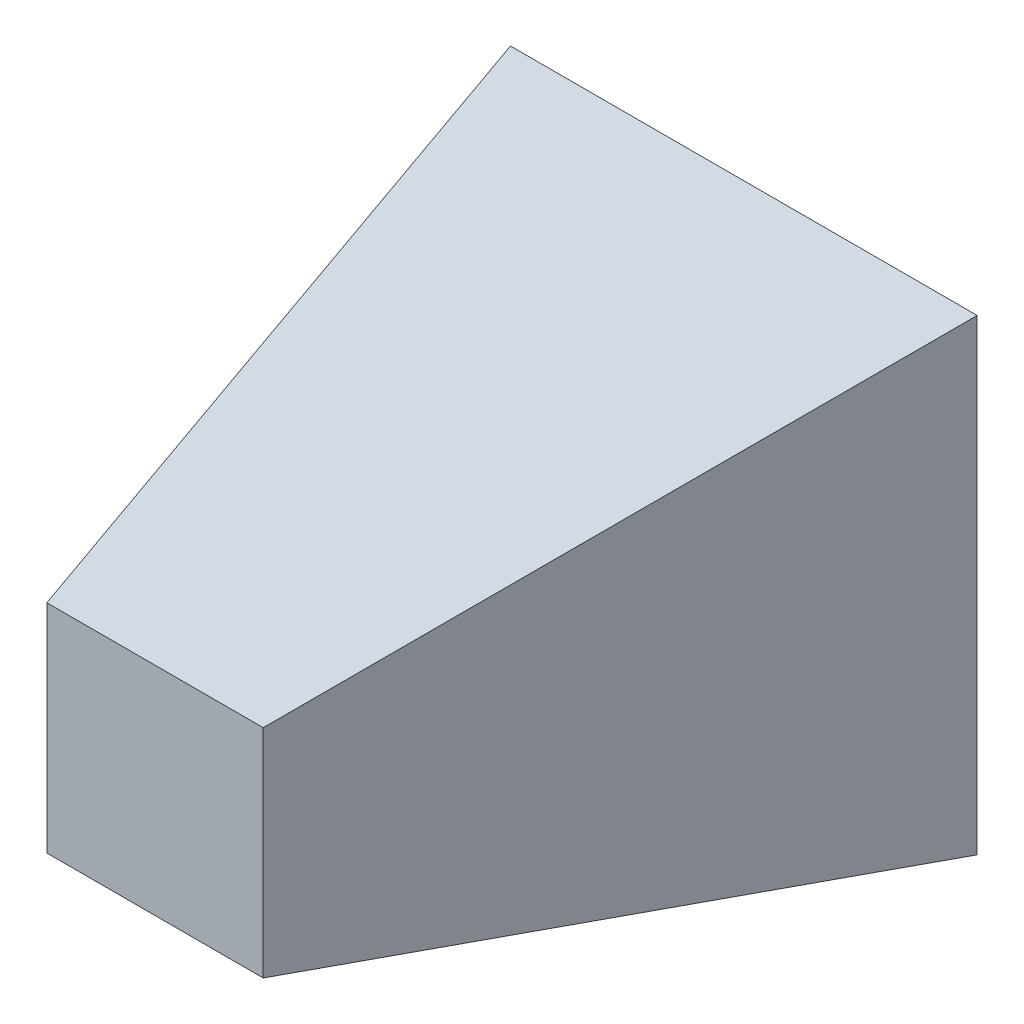
ISO-10303-21;
HEADER;
FILE_DESCRIPTION(('STEP AP214'),'2;1');
FILE_NAME('part.step','',(''),(''),'','','');
FILE_SCHEMA(('AUTOMOTIVE_DESIGN { 1 0 10303 214 1 1 1 1 }'));
ENDSEC;
DATA;
#1=APPLICATION_CONTEXT('core data for automotive mechanical design processes');
#2=APPLICATION_PROTOCOL_DEFINITION('international standard','automotive_design',2000,#1);
#3=PRODUCT_CONTEXT('',#1,'mechanical');
#4=PRODUCT('Part','Part','',(#3));
#5=PRODUCT_RELATED_PRODUCT_CATEGORY('part','',(#4));
#6=PRODUCT_DEFINITION_FORMATION('','',#4);
#7=PRODUCT_DEFINITION_CONTEXT('part definition',#1,'design');
#8=PRODUCT_DEFINITION('design','',#6,#7);
#9=PRODUCT_DEFINITION_SHAPE('','',#8);
#10=(LENGTH_UNIT() NAMED_UNIT(*) SI_UNIT(.MILLI.,.METRE.));
#11=(NAMED_UNIT(*) PLANE_ANGLE_UNIT() SI_UNIT($,.RADIAN.));
#12=(NAMED_UNIT(*) SI_UNIT($,.STERADIAN.) SOLID_ANGLE_UNIT());
#13=UNCERTAINTY_MEASURE_WITH_UNIT(LENGTH_MEASURE(1.E-05),#10,'distance_accuracy_value','');
#14=(GEOMETRIC_REPRESENTATION_CONTEXT(3) GLOBAL_UNCERTAINTY_ASSIGNED_CONTEXT((#13)) GLOBAL_UNIT_ASSIGNED_CONTEXT((#10,
#11,#12)) REPRESENTATION_CONTEXT('',''));
#15=CARTESIAN_POINT('',(0.,0.,0.));
#16=DIRECTION('',(0.,0.,1.));
#17=DIRECTION('',(1.,0.,0.));
#18=AXIS2_PLACEMENT_3D('',#15,#16,#17);
#19=CARTESIAN_POINT('',(-9.243,5.8375,-21.));
#20=DIRECTION('',(-0.978147600733806,0.,0.207911690817759));
#21=DIRECTION('',(0.207911690817759,0.,0.978147600733806));
#22=AXIS2_PLACEMENT_3D('',#19,#20,#21);
#23=PLANE('',#22);
#24=DIRECTION('',(0.,-1.,0.));
#25=VECTOR('',#24,1.);
#26=CARTESIAN_POINT('',(-9.243,5.8375,-21.));
#27=LINE('',#26,#25);
#28=CARTESIAN_POINT('',(-9.243,5.8375,-21.));
#29=VERTEX_POINT('',#28);
#30=CARTESIAN_POINT('',(-9.243,5.20286408001963,-21.));
#31=VERTEX_POINT('',#30);
#32=EDGE_CURVE('E11',#29,#31,#27,.T.);
#33=ORIENTED_EDGE('',*,*,#32,.T.);
#34=DIRECTION('',(-0.203558594952779,-0.203558594952779,-0.957667894857973));
#35=VECTOR('',#34,1.);
#36=CARTESIAN_POINT('',(-9.243,5.20286408001963,-21.));
#37=LINE('',#36,#35);
#38=CARTESIAN_POINT('',(-9.07295475066398,5.37290932935565,-20.2));
#39=VERTEX_POINT('',#38);
#40=EDGE_CURVE('E24',#39,#31,#37,.T.);
#41=ORIENTED_EDGE('',*,*,#40,.F.);
#42=DIRECTION('',(0.,-1.,0.));
#43=VECTOR('',#42,1.);
#44=CARTESIAN_POINT('',(-9.07295475066398,5.8375,-20.2));
#45=LINE('',#44,#43);
#46=CARTESIAN_POINT('',(-9.07295475066398,5.66745475066398,-20.2));
#47=VERTEX_POINT('',#46);
#48=EDGE_CURVE('E88',#47,#39,#45,.T.);
#49=ORIENTED_EDGE('',*,*,#48,.F.);
#50=DIRECTION('',(-0.203558594952779,0.203558594952779,-0.957667894857973));
#51=VECTOR('',#50,1.);
#52=CARTESIAN_POINT('',(-9.243,5.8375,-21.));
#53=LINE('',#52,#51);
#54=EDGE_CURVE('E77',#47,#29,#53,.T.);
#55=ORIENTED_EDGE('',*,*,#54,.T.);
#56=EDGE_LOOP('',(#33,#41,#49,#55));
#57=FACE_BOUND('',#56,.T.);
#58=ADVANCED_FACE('F17',(#57),#23,.T.);
#59=CARTESIAN_POINT('',(-9.243,5.20286408001963,-21.));
#60=DIRECTION('',(0.,-0.978147600733806,0.207911690817759));
#61=DIRECTION('',(0.,-0.207911690817759,-0.978147600733806));
#62=AXIS2_PLACEMENT_3D('',#59,#60,#61);
#63=PLANE('',#62);
#64=DIRECTION('',(1.,0.,0.));
#65=VECTOR('',#64,1.);
#66=CARTESIAN_POINT('',(-9.243,5.20286408001963,-21.));
#67=LINE('',#66,#65);
#68=CARTESIAN_POINT('',(-8.6088347320442,5.20286408001963,-21.));
#69=VERTEX_POINT('',#68);
#70=EDGE_CURVE('E85',#31,#69,#67,.T.);
#71=ORIENTED_EDGE('',*,*,#70,.T.);
#72=DIRECTION('',(0.203558594952779,-0.203558594952779,-0.957667894857973));
#73=VECTOR('',#72,1.);
#74=CARTESIAN_POINT('',(-8.63513157049027,5.22916091846572,-20.8762831020625));
#75=LINE('',#74,#73);
#76=CARTESIAN_POINT('',(-8.77887998138021,5.37290932935565,-20.2));
#77=VERTEX_POINT('',#76);
#78=EDGE_CURVE('E83',#77,#69,#75,.T.);
#79=ORIENTED_EDGE('',*,*,#78,.F.);
#80=DIRECTION('',(1.,0.,0.));
#81=VECTOR('',#80,1.);
#82=CARTESIAN_POINT('',(-9.243,5.37290932935565,-20.2));
#83=LINE('',#82,#81);
#84=EDGE_CURVE('E72',#39,#77,#83,.T.);
#85=ORIENTED_EDGE('',*,*,#84,.F.);
#86=ORIENTED_EDGE('',*,*,#40,.T.);
#87=EDGE_LOOP('',(#71,#79,#85,#86));
#88=FACE_BOUND('',#87,.T.);
#89=ADVANCED_FACE('F90',(#88),#63,.T.);
#90=CARTESIAN_POINT('',(-8.6088347320442,5.8375,-21.));
#91=DIRECTION('',(0.978147600733806,0.,0.207911690817759));
#92=DIRECTION('',(0.207911690817759,0.,-0.978147600733806));
#93=AXIS2_PLACEMENT_3D('',#90,#91,#92);
#94=PLANE('',#93);
#95=DIRECTION('',(0.,1.,0.));
#96=VECTOR('',#95,1.);
#97=CARTESIAN_POINT('',(-8.6088347320442,5.8375,-21.));
#98=LINE('',#97,#96);
#99=CARTESIAN_POINT('',(-8.6088347320442,5.8375,-21.));
#100=VERTEX_POINT('',#99);
#101=EDGE_CURVE('E60',#69,#100,#98,.T.);
#102=ORIENTED_EDGE('',*,*,#101,.T.);
#103=DIRECTION('',(0.203558594952779,0.203558594952779,-0.957667894857973));
#104=VECTOR('',#103,1.);
#105=CARTESIAN_POINT('',(-8.63511206850518,5.81122266353901,-20.8763748516888));
#106=LINE('',#105,#104);
#107=CARTESIAN_POINT('',(-8.77887998138021,5.66745475066398,-20.2));
#108=VERTEX_POINT('',#107);
#109=EDGE_CURVE('E54',#108,#100,#106,.T.);
#110=ORIENTED_EDGE('',*,*,#109,.F.);
#111=DIRECTION('',(0.,1.,0.));
#112=VECTOR('',#111,1.);
#113=CARTESIAN_POINT('',(-8.77887998138021,5.8375,-20.2));
#114=LINE('',#113,#112);
#115=EDGE_CURVE('E58',#77,#108,#114,.T.);
#116=ORIENTED_EDGE('',*,*,#115,.F.);
#117=ORIENTED_EDGE('',*,*,#78,.T.);
#118=EDGE_LOOP('',(#102,#110,#116,#117));
#119=FACE_BOUND('',#118,.T.);
#120=ADVANCED_FACE('F56',(#119),#94,.T.);
#121=CARTESIAN_POINT('',(-9.243,5.8375,-21.));
#122=DIRECTION('',(0.,0.978147600733806,0.207911690817759));
#123=DIRECTION('',(0.,-0.207911690817759,0.978147600733806));
#124=AXIS2_PLACEMENT_3D('',#121,#122,#123);
#125=PLANE('',#124);
#126=DIRECTION('',(-1.,0.,0.));
#127=VECTOR('',#126,1.);
#128=CARTESIAN_POINT('',(-9.243,5.8375,-21.));
#129=LINE('',#128,#127);
#130=EDGE_CURVE('E73',#100,#29,#129,.T.);
#131=ORIENTED_EDGE('',*,*,#130,.T.);
#132=ORIENTED_EDGE('',*,*,#54,.F.);
#133=DIRECTION('',(-1.,0.,0.));
#134=VECTOR('',#133,1.);
#135=CARTESIAN_POINT('',(-9.243,5.66745475066398,-20.2));
#136=LINE('',#135,#134);
#137=EDGE_CURVE('E70',#108,#47,#136,.T.);
#138=ORIENTED_EDGE('',*,*,#137,.F.);
#139=ORIENTED_EDGE('',*,*,#109,.T.);
#140=EDGE_LOOP('',(#131,#132,#138,#139));
#141=FACE_BOUND('',#140,.T.);
#142=ADVANCED_FACE('F76',(#141),#125,.T.);
#143=CARTESIAN_POINT('',(0.,0.,-20.2));
#144=DIRECTION('',(0.,0.,1.));
#145=DIRECTION('',(1.,0.,0.));
#146=AXIS2_PLACEMENT_3D('',#143,#144,#145);
#147=PLANE('',#146);
#148=ORIENTED_EDGE('',*,*,#48,.T.);
#149=ORIENTED_EDGE('',*,*,#84,.T.);
#150=ORIENTED_EDGE('',*,*,#115,.T.);
#151=ORIENTED_EDGE('',*,*,#137,.T.);
#152=EDGE_LOOP('',(#148,#149,#150,#151));
#153=FACE_BOUND('',#152,.T.);
#154=ADVANCED_FACE('F69',(#153),#147,.T.);
#155=CARTESIAN_POINT('',(0.,0.,-21.));
#156=DIRECTION('',(0.,0.,1.));
#157=DIRECTION('',(1.,0.,0.));
#158=AXIS2_PLACEMENT_3D('',#155,#156,#157);
#159=PLANE('',#158);
#160=ORIENTED_EDGE('',*,*,#32,.F.);
#161=ORIENTED_EDGE('',*,*,#130,.F.);
#162=ORIENTED_EDGE('',*,*,#101,.F.);
#163=ORIENTED_EDGE('',*,*,#70,.F.);
#164=EDGE_LOOP('',(#160,#161,#162,#163));
#165=FACE_BOUND('',#164,.T.);
#166=ADVANCED_FACE('F91',(#165),#159,.F.);
#167=CLOSED_SHELL('',(#58,#89,#120,#142,#154,#166));
#168=MANIFOLD_SOLID_BREP('B1',#167);
#169=ADVANCED_BREP_SHAPE_REPRESENTATION('',(#18,#168),#14);
#170=SHAPE_DEFINITION_REPRESENTATION(#9,#169);
ENDSEC;
END-ISO-10303-21;
